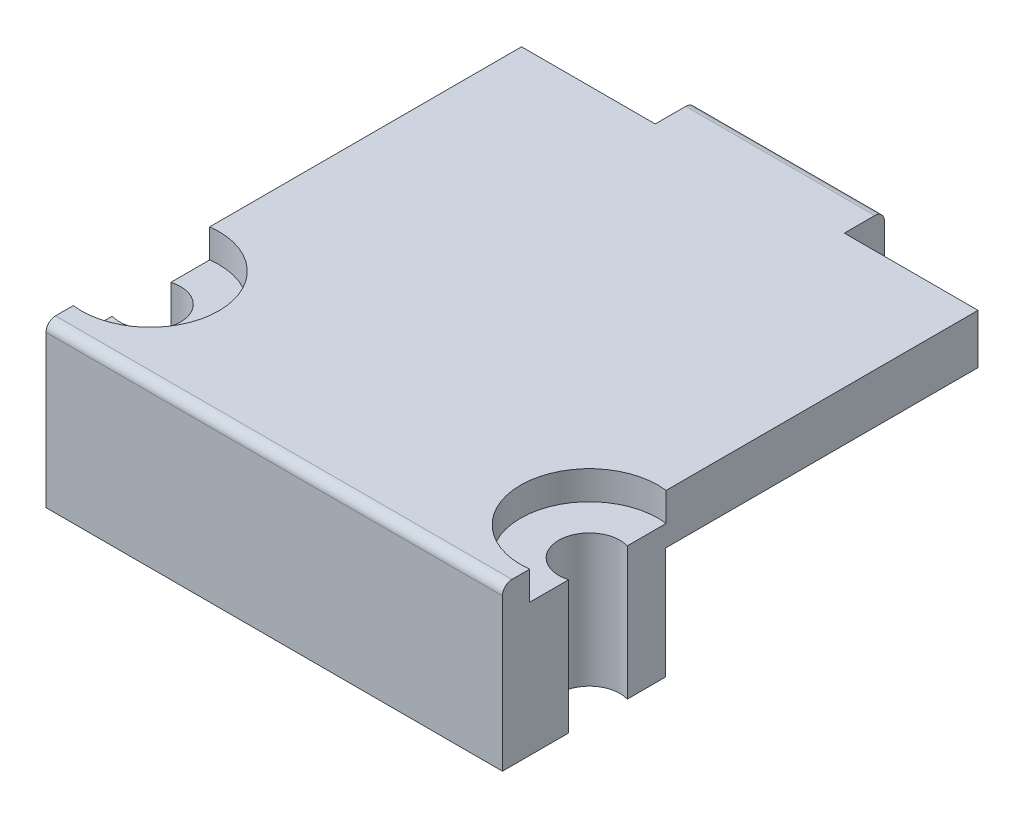
ISO-10303-21;
HEADER;
FILE_DESCRIPTION(('STEP AP214'),'2;1');
FILE_NAME('part.step','',(''),(''),'','','');
FILE_SCHEMA(('AUTOMOTIVE_DESIGN { 1 0 10303 214 1 1 1 1 }'));
ENDSEC;
DATA;
#1=APPLICATION_CONTEXT('core data for automotive mechanical design processes');
#2=APPLICATION_PROTOCOL_DEFINITION('international standard','automotive_design',2000,#1);
#3=PRODUCT_CONTEXT('',#1,'mechanical');
#4=PRODUCT('Part','Part','',(#3));
#5=PRODUCT_RELATED_PRODUCT_CATEGORY('part','',(#4));
#6=PRODUCT_DEFINITION_FORMATION('','',#4);
#7=PRODUCT_DEFINITION_CONTEXT('part definition',#1,'design');
#8=PRODUCT_DEFINITION('design','',#6,#7);
#9=PRODUCT_DEFINITION_SHAPE('','',#8);
#10=(LENGTH_UNIT() NAMED_UNIT(*) SI_UNIT(.MILLI.,.METRE.));
#11=(NAMED_UNIT(*) PLANE_ANGLE_UNIT() SI_UNIT($,.RADIAN.));
#12=(NAMED_UNIT(*) SI_UNIT($,.STERADIAN.) SOLID_ANGLE_UNIT());
#13=UNCERTAINTY_MEASURE_WITH_UNIT(LENGTH_MEASURE(1.E-05),#10,'distance_accuracy_value','');
#14=(GEOMETRIC_REPRESENTATION_CONTEXT(3) GLOBAL_UNCERTAINTY_ASSIGNED_CONTEXT((#13)) GLOBAL_UNIT_ASSIGNED_CONTEXT((#10,
#11,#12)) REPRESENTATION_CONTEXT('',''));
#15=CARTESIAN_POINT('',(0.,0.,0.));
#16=DIRECTION('',(0.,0.,1.));
#17=DIRECTION('',(1.,0.,0.));
#18=AXIS2_PLACEMENT_3D('',#15,#16,#17);
#19=CARTESIAN_POINT('',(11.5,-5.851,7.44999999999999));
#20=DIRECTION('',(0.,1.,0.));
#21=DIRECTION('',(0.,0.,1.));
#22=AXIS2_PLACEMENT_3D('',#19,#20,#21);
#23=CYLINDRICAL_SURFACE('',#22,1.6);
#24=CARTESIAN_POINT('',(11.5,1.1,7.44999999999999));
#25=DIRECTION('',(0.,1.,0.));
#26=DIRECTION('',(0.,0.,1.));
#27=AXIS2_PLACEMENT_3D('',#24,#25,#26);
#28=CIRCLE('',#27,1.6);
#29=CARTESIAN_POINT('',(11.95,1.1,8.98541525327841));
#30=VERTEX_POINT('',#29);
#31=CARTESIAN_POINT('',(11.95,1.1,5.91458474672158));
#32=VERTEX_POINT('',#31);
#33=EDGE_CURVE('E335',#30,#32,#28,.F.);
#34=ORIENTED_EDGE('',*,*,#33,.F.);
#35=DIRECTION('',(0.,1.,0.));
#36=VECTOR('',#35,1.);
#37=CARTESIAN_POINT('',(11.95,-5.851,8.98541525327841));
#38=LINE('',#37,#36);
#39=CARTESIAN_POINT('',(11.95,-5.85,8.98541525327842));
#40=VERTEX_POINT('',#39);
#41=EDGE_CURVE('E413',#30,#40,#38,.F.);
#42=ORIENTED_EDGE('',*,*,#41,.T.);
#43=CARTESIAN_POINT('',(11.5,-5.85,7.45000000000001));
#44=DIRECTION('',(0.,1.,0.));
#45=DIRECTION('',(0.,0.,1.));
#46=AXIS2_PLACEMENT_3D('',#43,#44,#45);
#47=CIRCLE('',#46,1.6);
#48=CARTESIAN_POINT('',(11.95,-5.85,5.9145847467216));
#49=VERTEX_POINT('',#48);
#50=EDGE_CURVE('E449',#40,#49,#47,.F.);
#51=ORIENTED_EDGE('',*,*,#50,.T.);
#52=DIRECTION('',(0.,1.,0.));
#53=VECTOR('',#52,1.);
#54=CARTESIAN_POINT('',(11.95,-5.851,5.91458474672158));
#55=LINE('',#54,#53);
#56=EDGE_CURVE('E409',#49,#32,#55,.T.);
#57=ORIENTED_EDGE('',*,*,#56,.T.);
#58=EDGE_LOOP('',(#34,#42,#51,#57));
#59=FACE_BOUND('',#58,.T.);
#60=ADVANCED_FACE('F45',(#59),#23,.F.);
#61=CARTESIAN_POINT('',(-11.5,-5.851,7.45));
#62=DIRECTION('',(0.,1.,0.));
#63=DIRECTION('',(0.,0.,1.));
#64=AXIS2_PLACEMENT_3D('',#61,#62,#63);
#65=CYLINDRICAL_SURFACE('',#64,1.6);
#66=CARTESIAN_POINT('',(-11.5,1.1,7.45));
#67=DIRECTION('',(0.,1.,0.));
#68=DIRECTION('',(0.,0.,1.));
#69=AXIS2_PLACEMENT_3D('',#66,#67,#68);
#70=CIRCLE('',#69,1.6);
#71=CARTESIAN_POINT('',(-11.95,1.1,5.91458474672159));
#72=VERTEX_POINT('',#71);
#73=CARTESIAN_POINT('',(-11.95,1.1,8.98541525327841));
#74=VERTEX_POINT('',#73);
#75=EDGE_CURVE('E332',#72,#74,#70,.F.);
#76=ORIENTED_EDGE('',*,*,#75,.F.);
#77=DIRECTION('',(0.,1.,0.));
#78=VECTOR('',#77,1.);
#79=CARTESIAN_POINT('',(-11.95,-5.851,5.91458474672159));
#80=LINE('',#79,#78);
#81=CARTESIAN_POINT('',(-11.95,-5.85,5.91458474672159));
#82=VERTEX_POINT('',#81);
#83=EDGE_CURVE('E403',#72,#82,#80,.F.);
#84=ORIENTED_EDGE('',*,*,#83,.T.);
#85=CARTESIAN_POINT('',(-11.5,-5.85,7.45));
#86=DIRECTION('',(0.,1.,0.));
#87=DIRECTION('',(0.,0.,1.));
#88=AXIS2_PLACEMENT_3D('',#85,#86,#87);
#89=CIRCLE('',#88,1.6);
#90=CARTESIAN_POINT('',(-11.95,-5.85,8.98541525327841));
#91=VERTEX_POINT('',#90);
#92=EDGE_CURVE('E429',#82,#91,#89,.F.);
#93=ORIENTED_EDGE('',*,*,#92,.T.);
#94=DIRECTION('',(0.,1.,0.));
#95=VECTOR('',#94,1.);
#96=CARTESIAN_POINT('',(-11.95,-5.851,8.98541525327841));
#97=LINE('',#96,#95);
#98=EDGE_CURVE('E405',#91,#74,#97,.T.);
#99=ORIENTED_EDGE('',*,*,#98,.T.);
#100=EDGE_LOOP('',(#76,#84,#93,#99));
#101=FACE_BOUND('',#100,.T.);
#102=ADVANCED_FACE('F532',(#101),#65,.F.);
#103=CARTESIAN_POINT('',(-11.95,-5.85,10.45));
#104=DIRECTION('',(0.,0.,1.));
#105=DIRECTION('',(1.,0.,0.));
#106=AXIS2_PLACEMENT_3D('',#103,#104,#105);
#107=PLANE('',#106);
#108=DIRECTION('',(0.,1.,0.));
#109=VECTOR('',#108,1.);
#110=CARTESIAN_POINT('',(-9.57602988247903,-14.0303636925574,10.45));
#111=LINE('',#110,#109);
#112=CARTESIAN_POINT('',(-9.57602988247903,0.,10.45));
#113=VERTEX_POINT('',#112);
#114=CARTESIAN_POINT('',(-9.57602988247903,-5.85,10.45));
#115=VERTEX_POINT('',#114);
#116=EDGE_CURVE('E416',#113,#115,#111,.F.);
#117=ORIENTED_EDGE('',*,*,#116,.F.);
#118=DIRECTION('',(1.,0.,0.));
#119=VECTOR('',#118,1.);
#120=CARTESIAN_POINT('',(-11.95,0.,10.45));
#121=LINE('',#120,#119);
#122=CARTESIAN_POINT('',(9.57602988247901,0.,10.45));
#123=VERTEX_POINT('',#122);
#124=EDGE_CURVE('E399',#113,#123,#121,.T.);
#125=ORIENTED_EDGE('',*,*,#124,.T.);
#126=DIRECTION('',(0.,1.,0.));
#127=VECTOR('',#126,1.);
#128=CARTESIAN_POINT('',(9.57602988247901,-14.0303636925574,10.45));
#129=LINE('',#128,#127);
#130=CARTESIAN_POINT('',(9.57602988247901,-5.85,10.45));
#131=VERTEX_POINT('',#130);
#132=EDGE_CURVE('E419',#131,#123,#129,.T.);
#133=ORIENTED_EDGE('',*,*,#132,.F.);
#134=DIRECTION('',(1.,0.,0.));
#135=VECTOR('',#134,1.);
#136=CARTESIAN_POINT('',(-11.95,-5.85,10.45));
#137=LINE('',#136,#135);
#138=EDGE_CURVE('E275',#115,#131,#137,.T.);
#139=ORIENTED_EDGE('',*,*,#138,.F.);
#140=EDGE_LOOP('',(#117,#125,#133,#139));
#141=FACE_BOUND('',#140,.T.);
#142=ADVANCED_FACE('F539',(#141),#107,.F.);
#143=CARTESIAN_POINT('',(-11.95,2.6,-12.45));
#144=DIRECTION('',(1.,0.,0.));
#145=DIRECTION('',(0.,0.,-1.));
#146=AXIS2_PLACEMENT_3D('',#143,#144,#145);
#147=PLANE('',#146);
#148=DIRECTION('',(0.,0.,1.));
#149=VECTOR('',#148,1.);
#150=CARTESIAN_POINT('',(-11.95,1.1,-12.45));
#151=LINE('',#150,#149);
#152=CARTESIAN_POINT('',(-11.95,1.1,3.8782357300628));
#153=VERTEX_POINT('',#152);
#154=EDGE_CURVE('E239',#153,#72,#151,.T.);
#155=ORIENTED_EDGE('',*,*,#154,.F.);
#156=DIRECTION('',(0.,1.,0.));
#157=VECTOR('',#156,1.);
#158=CARTESIAN_POINT('',(-11.95,1.1,3.8782357300628));
#159=LINE('',#158,#157);
#160=CARTESIAN_POINT('',(-11.95,2.6,3.8782357300628));
#161=VERTEX_POINT('',#160);
#162=EDGE_CURVE('E220',#153,#161,#159,.T.);
#163=ORIENTED_EDGE('',*,*,#162,.T.);
#164=DIRECTION('',(0.,0.,1.));
#165=VECTOR('',#164,1.);
#166=CARTESIAN_POINT('',(-11.95,2.6,-12.45));
#167=LINE('',#166,#165);
#168=CARTESIAN_POINT('',(-11.95,2.6,-12.45));
#169=VERTEX_POINT('',#168);
#170=EDGE_CURVE('E236',#169,#161,#167,.T.);
#171=ORIENTED_EDGE('',*,*,#170,.F.);
#172=DIRECTION('',(0.,-1.,0.));
#173=VECTOR('',#172,1.);
#174=CARTESIAN_POINT('',(-11.95,2.6,-12.45));
#175=LINE('',#174,#173);
#176=CARTESIAN_POINT('',(-11.95,0.,-12.45));
#177=VERTEX_POINT('',#176);
#178=EDGE_CURVE('E319',#169,#177,#175,.T.);
#179=ORIENTED_EDGE('',*,*,#178,.T.);
#180=DIRECTION('',(0.,0.,1.));
#181=VECTOR('',#180,1.);
#182=CARTESIAN_POINT('',(-11.95,0.,-12.45));
#183=LINE('',#182,#181);
#184=CARTESIAN_POINT('',(-11.95,0.,3.91458474672159));
#185=VERTEX_POINT('',#184);
#186=EDGE_CURVE('E274',#177,#185,#183,.T.);
#187=ORIENTED_EDGE('',*,*,#186,.T.);
#188=DIRECTION('',(0.,1.,0.));
#189=VECTOR('',#188,1.);
#190=CARTESIAN_POINT('',(-11.95,-14.0303636925574,3.91458474672159));
#191=LINE('',#190,#189);
#192=CARTESIAN_POINT('',(-11.95,-5.85,3.91458474672159));
#193=VERTEX_POINT('',#192);
#194=EDGE_CURVE('E436',#193,#185,#191,.T.);
#195=ORIENTED_EDGE('',*,*,#194,.F.);
#196=DIRECTION('',(0.,0.,1.));
#197=VECTOR('',#196,1.);
#198=CARTESIAN_POINT('',(-11.95,-5.85,5.91458474672159));
#199=LINE('',#198,#197);
#200=EDGE_CURVE('E432',#193,#82,#199,.T.);
#201=ORIENTED_EDGE('',*,*,#200,.T.);
#202=ORIENTED_EDGE('',*,*,#83,.F.);
#203=EDGE_LOOP('',(#155,#163,#171,#179,#187,#195,#201,#202));
#204=FACE_BOUND('',#203,.T.);
#205=ADVANCED_FACE('F234',(#204),#147,.F.);
#206=CARTESIAN_POINT('',(11.95,2.6,12.45));
#207=DIRECTION('',(-1.,0.,0.));
#208=DIRECTION('',(0.,0.,1.));
#209=AXIS2_PLACEMENT_3D('',#206,#207,#208);
#210=PLANE('',#209);
#211=DIRECTION('',(0.,0.,-1.));
#212=VECTOR('',#211,1.);
#213=CARTESIAN_POINT('',(11.95,2.6,12.45));
#214=LINE('',#213,#212);
#215=CARTESIAN_POINT('',(11.95,2.6,11.95));
#216=VERTEX_POINT('',#215);
#217=CARTESIAN_POINT('',(11.95,2.6,11.0217642699372));
#218=VERTEX_POINT('',#217);
#219=EDGE_CURVE('E254',#216,#218,#214,.T.);
#220=ORIENTED_EDGE('',*,*,#219,.F.);
#221=CARTESIAN_POINT('',(11.95,2.1,11.95));
#222=DIRECTION('',(-1.,0.,0.));
#223=DIRECTION('',(0.,0.,1.));
#224=AXIS2_PLACEMENT_3D('',#221,#222,#223);
#225=CIRCLE('',#224,0.5);
#226=CARTESIAN_POINT('',(11.95,2.1,12.45));
#227=VERTEX_POINT('',#226);
#228=EDGE_CURVE('E68',#216,#227,#225,.F.);
#229=ORIENTED_EDGE('',*,*,#228,.T.);
#230=DIRECTION('',(0.,-1.,0.));
#231=VECTOR('',#230,1.);
#232=CARTESIAN_POINT('',(11.95,2.6,12.45));
#233=LINE('',#232,#231);
#234=CARTESIAN_POINT('',(11.95,-5.85,12.45));
#235=VERTEX_POINT('',#234);
#236=EDGE_CURVE('E313',#227,#235,#233,.T.);
#237=ORIENTED_EDGE('',*,*,#236,.T.);
#238=DIRECTION('',(0.,0.,1.));
#239=VECTOR('',#238,1.);
#240=CARTESIAN_POINT('',(11.95,-5.85,10.45));
#241=LINE('',#240,#239);
#242=EDGE_CURVE('E395',#40,#235,#241,.T.);
#243=ORIENTED_EDGE('',*,*,#242,.F.);
#244=ORIENTED_EDGE('',*,*,#41,.F.);
#245=DIRECTION('',(0.,0.,-1.));
#246=VECTOR('',#245,1.);
#247=CARTESIAN_POINT('',(11.95,1.1,12.45));
#248=LINE('',#247,#246);
#249=CARTESIAN_POINT('',(11.95,1.1,11.0217642699372));
#250=VERTEX_POINT('',#249);
#251=EDGE_CURVE('E496',#250,#30,#248,.T.);
#252=ORIENTED_EDGE('',*,*,#251,.F.);
#253=DIRECTION('',(0.,1.,0.));
#254=VECTOR('',#253,1.);
#255=CARTESIAN_POINT('',(11.95,1.1,11.0217642699372));
#256=LINE('',#255,#254);
#257=EDGE_CURVE('E487',#250,#218,#256,.T.);
#258=ORIENTED_EDGE('',*,*,#257,.T.);
#259=EDGE_LOOP('',(#220,#229,#237,#243,#244,#252,#258));
#260=FACE_BOUND('',#259,.T.);
#261=ADVANCED_FACE('F557',(#260),#210,.F.);
#262=CARTESIAN_POINT('',(0.,0.,0.));
#263=DIRECTION('',(0.,1.,0.));
#264=DIRECTION('',(0.,0.,1.));
#265=AXIS2_PLACEMENT_3D('',#262,#263,#264);
#266=PLANE('',#265);
#267=CARTESIAN_POINT('',(-11.5,0.,7.45));
#268=DIRECTION('',(0.,-1.,0.));
#269=DIRECTION('',(0.,0.,1.));
#270=AXIS2_PLACEMENT_3D('',#267,#268,#269);
#271=CIRCLE('',#270,3.56393897438125);
#272=EDGE_CURVE('E439',#185,#113,#271,.T.);
#273=ORIENTED_EDGE('',*,*,#272,.F.);
#274=ORIENTED_EDGE('',*,*,#186,.F.);
#275=DIRECTION('',(-1.,0.,0.));
#276=VECTOR('',#275,1.);
#277=CARTESIAN_POINT('',(-4.95,0.,-12.45));
#278=LINE('',#277,#276);
#279=CARTESIAN_POINT('',(-4.95,0.,-12.45));
#280=VERTEX_POINT('',#279);
#281=EDGE_CURVE('E270',#280,#177,#278,.T.);
#282=ORIENTED_EDGE('',*,*,#281,.F.);
#283=DIRECTION('',(0.,0.,1.));
#284=VECTOR('',#283,1.);
#285=CARTESIAN_POINT('',(-4.95,0.,-14.55));
#286=LINE('',#285,#284);
#287=CARTESIAN_POINT('',(-4.95,0.,-14.55));
#288=VERTEX_POINT('',#287);
#289=EDGE_CURVE('E293',#288,#280,#286,.T.);
#290=ORIENTED_EDGE('',*,*,#289,.F.);
#291=DIRECTION('',(-1.,0.,0.));
#292=VECTOR('',#291,1.);
#293=CARTESIAN_POINT('',(4.95,0.,-14.55));
#294=LINE('',#293,#292);
#295=CARTESIAN_POINT('',(4.95,0.,-14.55));
#296=VERTEX_POINT('',#295);
#297=EDGE_CURVE('E289',#296,#288,#294,.T.);
#298=ORIENTED_EDGE('',*,*,#297,.F.);
#299=DIRECTION('',(0.,0.,-1.));
#300=VECTOR('',#299,1.);
#301=CARTESIAN_POINT('',(4.95,0.,-12.45));
#302=LINE('',#301,#300);
#303=CARTESIAN_POINT('',(4.95,0.,-12.45));
#304=VERTEX_POINT('',#303);
#305=EDGE_CURVE('E285',#304,#296,#302,.T.);
#306=ORIENTED_EDGE('',*,*,#305,.F.);
#307=DIRECTION('',(-1.,0.,0.));
#308=VECTOR('',#307,1.);
#309=CARTESIAN_POINT('',(11.95,0.,-12.45));
#310=LINE('',#309,#308);
#311=CARTESIAN_POINT('',(11.95,0.,-12.45));
#312=VERTEX_POINT('',#311);
#313=EDGE_CURVE('E282',#312,#304,#310,.T.);
#314=ORIENTED_EDGE('',*,*,#313,.F.);
#315=DIRECTION('',(0.,0.,-1.));
#316=VECTOR('',#315,1.);
#317=CARTESIAN_POINT('',(11.95,0.,12.45));
#318=LINE('',#317,#316);
#319=CARTESIAN_POINT('',(11.95,0.,3.9145847467216));
#320=VERTEX_POINT('',#319);
#321=EDGE_CURVE('E279',#320,#312,#318,.T.);
#322=ORIENTED_EDGE('',*,*,#321,.F.);
#323=CARTESIAN_POINT('',(11.5,0.,7.45000000000001));
#324=DIRECTION('',(0.,-1.,0.));
#325=DIRECTION('',(0.,0.,-1.));
#326=AXIS2_PLACEMENT_3D('',#323,#324,#325);
#327=CIRCLE('',#326,3.56393897438125);
#328=EDGE_CURVE('E442',#123,#320,#327,.T.);
#329=ORIENTED_EDGE('',*,*,#328,.F.);
#330=ORIENTED_EDGE('',*,*,#124,.F.);
#331=EDGE_LOOP('',(#273,#274,#282,#290,#298,#306,#314,#322,#329,#330));
#332=FACE_BOUND('',#331,.T.);
#333=ADVANCED_FACE('F381',(#332),#266,.F.);
#334=CARTESIAN_POINT('',(-4.95,2.6,-12.45));
#335=DIRECTION('',(0.,0.,1.));
#336=DIRECTION('',(1.,0.,0.));
#337=AXIS2_PLACEMENT_3D('',#334,#335,#336);
#338=PLANE('',#337);
#339=ORIENTED_EDGE('',*,*,#281,.T.);
#340=ORIENTED_EDGE('',*,*,#178,.F.);
#341=DIRECTION('',(-1.,0.,0.));
#342=VECTOR('',#341,1.);
#343=CARTESIAN_POINT('',(-4.95,2.6,-12.45));
#344=LINE('',#343,#342);
#345=CARTESIAN_POINT('',(-4.95,2.6,-12.45));
#346=VERTEX_POINT('',#345);
#347=EDGE_CURVE('E246',#346,#169,#344,.T.);
#348=ORIENTED_EDGE('',*,*,#347,.F.);
#349=DIRECTION('',(0.,-1.,0.));
#350=VECTOR('',#349,1.);
#351=CARTESIAN_POINT('',(-4.95,2.6,-12.45));
#352=LINE('',#351,#350);
#353=EDGE_CURVE('E269',#346,#280,#352,.T.);
#354=ORIENTED_EDGE('',*,*,#353,.T.);
#355=EDGE_LOOP('',(#339,#340,#348,#354));
#356=FACE_BOUND('',#355,.T.);
#357=ADVANCED_FACE('F383',(#356),#338,.F.);
#358=DIRECTION('',(0.,-1.,0.));
#359=VECTOR('',#358,1.);
#360=CARTESIAN_POINT('',(-11.95,2.6,12.45));
#361=LINE('',#360,#359);
#362=CARTESIAN_POINT('',(-11.95,2.1,12.45));
#363=VERTEX_POINT('',#362);
#364=CARTESIAN_POINT('',(-11.95,-5.85,12.45));
#365=VERTEX_POINT('',#364);
#366=EDGE_CURVE('E316',#363,#365,#361,.T.);
#367=ORIENTED_EDGE('',*,*,#366,.F.);
#368=CARTESIAN_POINT('',(-11.95,2.1,11.95));
#369=DIRECTION('',(1.,0.,0.));
#370=DIRECTION('',(0.,0.,-1.));
#371=AXIS2_PLACEMENT_3D('',#368,#369,#370);
#372=CIRCLE('',#371,0.5);
#373=CARTESIAN_POINT('',(-11.95,2.6,11.95));
#374=VERTEX_POINT('',#373);
#375=EDGE_CURVE('E11',#363,#374,#372,.F.);
#376=ORIENTED_EDGE('',*,*,#375,.T.);
#377=CARTESIAN_POINT('',(-11.95,2.6,11.0217642699372));
#378=VERTEX_POINT('',#377);
#379=EDGE_CURVE('E250',#378,#374,#167,.T.);
#380=ORIENTED_EDGE('',*,*,#379,.F.);
#381=DIRECTION('',(0.,1.,0.));
#382=VECTOR('',#381,1.);
#383=CARTESIAN_POINT('',(-11.95,1.1,11.0217642699372));
#384=LINE('',#383,#382);
#385=CARTESIAN_POINT('',(-11.95,1.1,11.0217642699372));
#386=VERTEX_POINT('',#385);
#387=EDGE_CURVE('E223',#378,#386,#384,.F.);
#388=ORIENTED_EDGE('',*,*,#387,.T.);
#389=DIRECTION('',(0.,0.,1.));
#390=VECTOR('',#389,1.);
#391=CARTESIAN_POINT('',(-11.95,1.1,-12.45));
#392=LINE('',#391,#390);
#393=EDGE_CURVE('E504',#74,#386,#392,.T.);
#394=ORIENTED_EDGE('',*,*,#393,.F.);
#395=ORIENTED_EDGE('',*,*,#98,.F.);
#396=DIRECTION('',(0.,0.,-1.));
#397=VECTOR('',#396,1.);
#398=CARTESIAN_POINT('',(-11.95,-5.85,10.45));
#399=LINE('',#398,#397);
#400=EDGE_CURVE('E388',#365,#91,#399,.T.);
#401=ORIENTED_EDGE('',*,*,#400,.F.);
#402=EDGE_LOOP('',(#367,#376,#380,#388,#394,#395,#401));
#403=FACE_BOUND('',#402,.T.);
#404=ADVANCED_FACE('F521',(#403),#147,.F.);
#405=CARTESIAN_POINT('',(-11.95,2.6,12.45));
#406=DIRECTION('',(0.,0.,-1.));
#407=DIRECTION('',(-1.,0.,0.));
#408=AXIS2_PLACEMENT_3D('',#405,#406,#407);
#409=PLANE('',#408);
#410=ORIENTED_EDGE('',*,*,#236,.F.);
#411=DIRECTION('',(1.,0.,0.));
#412=VECTOR('',#411,1.);
#413=CARTESIAN_POINT('',(-11.95,2.1,12.45));
#414=LINE('',#413,#412);
#415=EDGE_CURVE('E54',#227,#363,#414,.F.);
#416=ORIENTED_EDGE('',*,*,#415,.T.);
#417=ORIENTED_EDGE('',*,*,#366,.T.);
#418=DIRECTION('',(-1.,0.,0.));
#419=VECTOR('',#418,1.);
#420=CARTESIAN_POINT('',(-11.95,-5.85,12.45));
#421=LINE('',#420,#419);
#422=EDGE_CURVE('E391',#235,#365,#421,.T.);
#423=ORIENTED_EDGE('',*,*,#422,.F.);
#424=EDGE_LOOP('',(#410,#416,#417,#423));
#425=FACE_BOUND('',#424,.T.);
#426=ADVANCED_FACE('F571',(#425),#409,.F.);
#427=CARTESIAN_POINT('',(11.95,2.6,3.8782357300628));
#428=VERTEX_POINT('',#427);
#429=CARTESIAN_POINT('',(11.95,2.6,-12.45));
#430=VERTEX_POINT('',#429);
#431=EDGE_CURVE('E249',#428,#430,#214,.T.);
#432=ORIENTED_EDGE('',*,*,#431,.F.);
#433=DIRECTION('',(0.,1.,0.));
#434=VECTOR('',#433,1.);
#435=CARTESIAN_POINT('',(11.95,1.1,3.8782357300628));
#436=LINE('',#435,#434);
#437=CARTESIAN_POINT('',(11.95,1.1,3.8782357300628));
#438=VERTEX_POINT('',#437);
#439=EDGE_CURVE('E241',#428,#438,#436,.F.);
#440=ORIENTED_EDGE('',*,*,#439,.T.);
#441=DIRECTION('',(0.,0.,-1.));
#442=VECTOR('',#441,1.);
#443=CARTESIAN_POINT('',(11.95,1.1,12.45));
#444=LINE('',#443,#442);
#445=EDGE_CURVE('E499',#32,#438,#444,.T.);
#446=ORIENTED_EDGE('',*,*,#445,.F.);
#447=ORIENTED_EDGE('',*,*,#56,.F.);
#448=DIRECTION('',(0.,0.,-1.));
#449=VECTOR('',#448,1.);
#450=CARTESIAN_POINT('',(11.95,-5.85,5.9145847467216));
#451=LINE('',#450,#449);
#452=CARTESIAN_POINT('',(11.95,-5.85,3.9145847467216));
#453=VERTEX_POINT('',#452);
#454=EDGE_CURVE('E453',#49,#453,#451,.T.);
#455=ORIENTED_EDGE('',*,*,#454,.T.);
#456=DIRECTION('',(0.,1.,0.));
#457=VECTOR('',#456,1.);
#458=CARTESIAN_POINT('',(11.95,-14.0303636925574,3.9145847467216));
#459=LINE('',#458,#457);
#460=EDGE_CURVE('E445',#453,#320,#459,.T.);
#461=ORIENTED_EDGE('',*,*,#460,.T.);
#462=ORIENTED_EDGE('',*,*,#321,.T.);
#463=DIRECTION('',(0.,-1.,0.));
#464=VECTOR('',#463,1.);
#465=CARTESIAN_POINT('',(11.95,2.6,-12.45));
#466=LINE('',#465,#464);
#467=EDGE_CURVE('E309',#430,#312,#466,.T.);
#468=ORIENTED_EDGE('',*,*,#467,.F.);
#469=EDGE_LOOP('',(#432,#440,#446,#447,#455,#461,#462,#468));
#470=FACE_BOUND('',#469,.T.);
#471=ADVANCED_FACE('F567',(#470),#210,.F.);
#472=CARTESIAN_POINT('',(11.95,2.6,-12.45));
#473=DIRECTION('',(0.,0.,1.));
#474=DIRECTION('',(1.,0.,0.));
#475=AXIS2_PLACEMENT_3D('',#472,#473,#474);
#476=PLANE('',#475);
#477=ORIENTED_EDGE('',*,*,#313,.T.);
#478=DIRECTION('',(0.,-1.,0.));
#479=VECTOR('',#478,1.);
#480=CARTESIAN_POINT('',(4.95,2.6,-12.45));
#481=LINE('',#480,#479);
#482=CARTESIAN_POINT('',(4.95,2.6,-12.45));
#483=VERTEX_POINT('',#482);
#484=EDGE_CURVE('E305',#483,#304,#481,.T.);
#485=ORIENTED_EDGE('',*,*,#484,.F.);
#486=DIRECTION('',(-1.,0.,0.));
#487=VECTOR('',#486,1.);
#488=CARTESIAN_POINT('',(11.95,2.6,-12.45));
#489=LINE('',#488,#487);
#490=EDGE_CURVE('E260',#430,#483,#489,.T.);
#491=ORIENTED_EDGE('',*,*,#490,.F.);
#492=ORIENTED_EDGE('',*,*,#467,.T.);
#493=EDGE_LOOP('',(#477,#485,#491,#492));
#494=FACE_BOUND('',#493,.T.);
#495=ADVANCED_FACE('F564',(#494),#476,.F.);
#496=CARTESIAN_POINT('',(4.95,2.6,-12.45));
#497=DIRECTION('',(-1.,0.,0.));
#498=DIRECTION('',(0.,0.,1.));
#499=AXIS2_PLACEMENT_3D('',#496,#497,#498);
#500=PLANE('',#499);
#501=DIRECTION('',(0.,-1.,0.));
#502=VECTOR('',#501,1.);
#503=CARTESIAN_POINT('',(4.95,2.6,-14.55));
#504=LINE('',#503,#502);
#505=CARTESIAN_POINT('',(4.95,2.1,-14.55));
#506=VERTEX_POINT('',#505);
#507=EDGE_CURVE('E302',#506,#296,#504,.T.);
#508=ORIENTED_EDGE('',*,*,#507,.F.);
#509=CARTESIAN_POINT('',(4.95,2.1,-14.05));
#510=DIRECTION('',(-1.,0.,0.));
#511=DIRECTION('',(0.,0.,1.));
#512=AXIS2_PLACEMENT_3D('',#509,#510,#511);
#513=CIRCLE('',#512,0.5);
#514=CARTESIAN_POINT('',(4.95,2.6,-14.05));
#515=VERTEX_POINT('',#514);
#516=EDGE_CURVE('E352',#506,#515,#513,.F.);
#517=ORIENTED_EDGE('',*,*,#516,.T.);
#518=DIRECTION('',(0.,0.,-1.));
#519=VECTOR('',#518,1.);
#520=CARTESIAN_POINT('',(4.95,2.6,-12.45));
#521=LINE('',#520,#519);
#522=EDGE_CURVE('E263',#483,#515,#521,.T.);
#523=ORIENTED_EDGE('',*,*,#522,.F.);
#524=ORIENTED_EDGE('',*,*,#484,.T.);
#525=ORIENTED_EDGE('',*,*,#305,.T.);
#526=EDGE_LOOP('',(#508,#517,#523,#524,#525));
#527=FACE_BOUND('',#526,.T.);
#528=ADVANCED_FACE('F361',(#527),#500,.F.);
#529=CARTESIAN_POINT('',(4.95,2.6,-14.55));
#530=DIRECTION('',(0.,0.,1.));
#531=DIRECTION('',(1.,0.,0.));
#532=AXIS2_PLACEMENT_3D('',#529,#530,#531);
#533=PLANE('',#532);
#534=DIRECTION('',(0.,-1.,0.));
#535=VECTOR('',#534,1.);
#536=CARTESIAN_POINT('',(-4.95,2.6,-14.55));
#537=LINE('',#536,#535);
#538=CARTESIAN_POINT('',(-4.95,2.1,-14.55));
#539=VERTEX_POINT('',#538);
#540=EDGE_CURVE('E299',#539,#288,#537,.T.);
#541=ORIENTED_EDGE('',*,*,#540,.F.);
#542=DIRECTION('',(-1.,0.,0.));
#543=VECTOR('',#542,1.);
#544=CARTESIAN_POINT('',(4.95,2.1,-14.55));
#545=LINE('',#544,#543);
#546=EDGE_CURVE('E349',#539,#506,#545,.F.);
#547=ORIENTED_EDGE('',*,*,#546,.T.);
#548=ORIENTED_EDGE('',*,*,#507,.T.);
#549=ORIENTED_EDGE('',*,*,#297,.T.);
#550=EDGE_LOOP('',(#541,#547,#548,#549));
#551=FACE_BOUND('',#550,.T.);
#552=ADVANCED_FACE('F374',(#551),#533,.F.);
#553=CARTESIAN_POINT('',(-4.95,2.6,-14.55));
#554=DIRECTION('',(1.,0.,0.));
#555=DIRECTION('',(0.,0.,-1.));
#556=AXIS2_PLACEMENT_3D('',#553,#554,#555);
#557=PLANE('',#556);
#558=DIRECTION('',(0.,0.,1.));
#559=VECTOR('',#558,1.);
#560=CARTESIAN_POINT('',(-4.95,2.6,-14.55));
#561=LINE('',#560,#559);
#562=CARTESIAN_POINT('',(-4.95,2.6,-14.05));
#563=VERTEX_POINT('',#562);
#564=EDGE_CURVE('E266',#563,#346,#561,.T.);
#565=ORIENTED_EDGE('',*,*,#564,.F.);
#566=CARTESIAN_POINT('',(-4.95,2.1,-14.05));
#567=DIRECTION('',(1.,0.,0.));
#568=DIRECTION('',(0.,0.,-1.));
#569=AXIS2_PLACEMENT_3D('',#566,#567,#568);
#570=CIRCLE('',#569,0.5);
#571=EDGE_CURVE('E346',#563,#539,#570,.F.);
#572=ORIENTED_EDGE('',*,*,#571,.T.);
#573=ORIENTED_EDGE('',*,*,#540,.T.);
#574=ORIENTED_EDGE('',*,*,#289,.T.);
#575=ORIENTED_EDGE('',*,*,#353,.F.);
#576=EDGE_LOOP('',(#565,#572,#573,#574,#575));
#577=FACE_BOUND('',#576,.T.);
#578=ADVANCED_FACE('F371',(#577),#557,.F.);
#579=CARTESIAN_POINT('',(0.,2.6,0.));
#580=DIRECTION('',(0.,1.,0.));
#581=DIRECTION('',(0.,0.,1.));
#582=AXIS2_PLACEMENT_3D('',#579,#580,#581);
#583=PLANE('',#582);
#584=ORIENTED_EDGE('',*,*,#522,.T.);
#585=DIRECTION('',(-1.,0.,0.));
#586=VECTOR('',#585,1.);
#587=CARTESIAN_POINT('',(-4.95,2.6,-14.05));
#588=LINE('',#587,#586);
#589=EDGE_CURVE('E342',#515,#563,#588,.T.);
#590=ORIENTED_EDGE('',*,*,#589,.T.);
#591=ORIENTED_EDGE('',*,*,#564,.T.);
#592=ORIENTED_EDGE('',*,*,#347,.T.);
#593=ORIENTED_EDGE('',*,*,#170,.T.);
#594=CARTESIAN_POINT('',(-11.5,2.6,7.45));
#595=DIRECTION('',(0.,1.,0.));
#596=DIRECTION('',(0.,0.,1.));
#597=AXIS2_PLACEMENT_3D('',#594,#595,#596);
#598=CIRCLE('',#597,3.6);
#599=EDGE_CURVE('E216',#378,#161,#598,.T.);
#600=ORIENTED_EDGE('',*,*,#599,.F.);
#601=ORIENTED_EDGE('',*,*,#379,.T.);
#602=DIRECTION('',(1.,0.,0.));
#603=VECTOR('',#602,1.);
#604=CARTESIAN_POINT('',(11.95,2.6,11.95));
#605=LINE('',#604,#603);
#606=EDGE_CURVE('E338',#374,#216,#605,.T.);
#607=ORIENTED_EDGE('',*,*,#606,.T.);
#608=ORIENTED_EDGE('',*,*,#219,.T.);
#609=CARTESIAN_POINT('',(11.5,2.6,7.44999999999999));
#610=DIRECTION('',(0.,1.,0.));
#611=DIRECTION('',(0.,0.,1.));
#612=AXIS2_PLACEMENT_3D('',#609,#610,#611);
#613=CIRCLE('',#612,3.6);
#614=EDGE_CURVE('E229',#428,#218,#613,.T.);
#615=ORIENTED_EDGE('',*,*,#614,.F.);
#616=ORIENTED_EDGE('',*,*,#431,.T.);
#617=ORIENTED_EDGE('',*,*,#490,.T.);
#618=EDGE_LOOP('',(#584,#590,#591,#592,#593,#600,#601,#607,#608,#615,#616,#617));
#619=FACE_BOUND('',#618,.T.);
#620=ADVANCED_FACE('F244',(#619),#583,.T.);
#621=CARTESIAN_POINT('',(0.,-5.85,0.));
#622=DIRECTION('',(0.,1.,0.));
#623=DIRECTION('',(0.,0.,1.));
#624=AXIS2_PLACEMENT_3D('',#621,#622,#623);
#625=PLANE('',#624);
#626=CARTESIAN_POINT('',(-11.5,-5.85,7.45));
#627=DIRECTION('',(0.,1.,0.));
#628=DIRECTION('',(0.,0.,1.));
#629=AXIS2_PLACEMENT_3D('',#626,#627,#628);
#630=CIRCLE('',#629,3.56393897438125);
#631=CARTESIAN_POINT('',(-8.1100647479467,-5.85,6.35));
#632=VERTEX_POINT('',#631);
#633=EDGE_CURVE('E426',#632,#193,#630,.T.);
#634=ORIENTED_EDGE('',*,*,#633,.F.);
#635=DIRECTION('',(1.,0.,0.));
#636=VECTOR('',#635,1.);
#637=CARTESIAN_POINT('',(-8.43606102561875,-5.85,6.35));
#638=LINE('',#637,#636);
#639=CARTESIAN_POINT('',(-8.43606102561875,-5.85,6.35));
#640=VERTEX_POINT('',#639);
#641=EDGE_CURVE('E484',#640,#632,#638,.T.);
#642=ORIENTED_EDGE('',*,*,#641,.F.);
#643=DIRECTION('',(0.,0.,1.));
#644=VECTOR('',#643,1.);
#645=CARTESIAN_POINT('',(-8.43606102561875,-5.85,6.35));
#646=LINE('',#645,#644);
#647=CARTESIAN_POINT('',(-8.43606102561875,-5.85,8.55));
#648=VERTEX_POINT('',#647);
#649=EDGE_CURVE('E476',#640,#648,#646,.T.);
#650=ORIENTED_EDGE('',*,*,#649,.T.);
#651=DIRECTION('',(1.,0.,0.));
#652=VECTOR('',#651,1.);
#653=CARTESIAN_POINT('',(-8.43606102561875,-5.85,8.55));
#654=LINE('',#653,#652);
#655=CARTESIAN_POINT('',(-8.1100647479467,-5.85,8.55));
#656=VERTEX_POINT('',#655);
#657=EDGE_CURVE('E480',#648,#656,#654,.T.);
#658=ORIENTED_EDGE('',*,*,#657,.T.);
#659=EDGE_CURVE('E422',#115,#656,#630,.T.);
#660=ORIENTED_EDGE('',*,*,#659,.F.);
#661=ORIENTED_EDGE('',*,*,#138,.T.);
#662=CARTESIAN_POINT('',(11.5,-5.85,7.45000000000001));
#663=DIRECTION('',(0.,1.,0.));
#664=DIRECTION('',(0.,0.,1.));
#665=AXIS2_PLACEMENT_3D('',#662,#663,#664);
#666=CIRCLE('',#665,3.56393897438125);
#667=EDGE_CURVE('E457',#453,#131,#666,.T.);
#668=ORIENTED_EDGE('',*,*,#667,.F.);
#669=ORIENTED_EDGE('',*,*,#454,.F.);
#670=ORIENTED_EDGE('',*,*,#50,.F.);
#671=ORIENTED_EDGE('',*,*,#242,.T.);
#672=ORIENTED_EDGE('',*,*,#422,.T.);
#673=ORIENTED_EDGE('',*,*,#400,.T.);
#674=ORIENTED_EDGE('',*,*,#92,.F.);
#675=ORIENTED_EDGE('',*,*,#200,.F.);
#676=EDGE_LOOP('',(#634,#642,#650,#658,#660,#661,#668,#669,#670,#671,#672,#673,#674,#675));
#677=FACE_BOUND('',#676,.T.);
#678=ADVANCED_FACE('F545',(#677),#625,.F.);
#679=CARTESIAN_POINT('',(-11.5,-14.0303636925574,7.45));
#680=DIRECTION('',(0.,1.,0.));
#681=DIRECTION('',(0.,0.,1.));
#682=AXIS2_PLACEMENT_3D('',#679,#680,#681);
#683=CYLINDRICAL_SURFACE('',#682,3.56393897438125);
#684=CARTESIAN_POINT('',(-11.5,-3.75,7.45));
#685=DIRECTION('',(0.,-1.,0.));
#686=DIRECTION('',(0.,0.,-1.));
#687=AXIS2_PLACEMENT_3D('',#684,#685,#686);
#688=CIRCLE('',#687,3.56393897438125);
#689=CARTESIAN_POINT('',(-8.1100647479467,-3.75,6.35));
#690=VERTEX_POINT('',#689);
#691=CARTESIAN_POINT('',(-8.1100647479467,-3.75,8.55));
#692=VERTEX_POINT('',#691);
#693=EDGE_CURVE('E322',#690,#692,#688,.T.);
#694=ORIENTED_EDGE('',*,*,#693,.F.);
#695=DIRECTION('',(0.,1.,0.));
#696=VECTOR('',#695,1.);
#697=CARTESIAN_POINT('',(-8.1100647479467,-14.0303636925574,6.35));
#698=LINE('',#697,#696);
#699=EDGE_CURVE('E328',#690,#632,#698,.F.);
#700=ORIENTED_EDGE('',*,*,#699,.T.);
#701=ORIENTED_EDGE('',*,*,#633,.T.);
#702=ORIENTED_EDGE('',*,*,#194,.T.);
#703=ORIENTED_EDGE('',*,*,#272,.T.);
#704=ORIENTED_EDGE('',*,*,#116,.T.);
#705=ORIENTED_EDGE('',*,*,#659,.T.);
#706=DIRECTION('',(0.,1.,0.));
#707=VECTOR('',#706,1.);
#708=CARTESIAN_POINT('',(-8.1100647479467,-14.0303636925574,8.55));
#709=LINE('',#708,#707);
#710=EDGE_CURVE('E325',#692,#656,#709,.F.);
#711=ORIENTED_EDGE('',*,*,#710,.F.);
#712=EDGE_LOOP('',(#694,#700,#701,#702,#703,#704,#705,#711));
#713=FACE_BOUND('',#712,.T.);
#714=ADVANCED_FACE('F548',(#713),#683,.T.);
#715=CARTESIAN_POINT('',(11.5,-14.0303636925574,7.45000000000001));
#716=DIRECTION('',(0.,1.,0.));
#717=DIRECTION('',(0.,0.,1.));
#718=AXIS2_PLACEMENT_3D('',#715,#716,#717);
#719=CYLINDRICAL_SURFACE('',#718,3.56393897438125);
#720=ORIENTED_EDGE('',*,*,#667,.T.);
#721=ORIENTED_EDGE('',*,*,#132,.T.);
#722=ORIENTED_EDGE('',*,*,#328,.T.);
#723=ORIENTED_EDGE('',*,*,#460,.F.);
#724=EDGE_LOOP('',(#720,#721,#722,#723));
#725=FACE_BOUND('',#724,.T.);
#726=ADVANCED_FACE('F605',(#725),#719,.T.);
#727=CARTESIAN_POINT('',(-8.43606102561875,-3.75,6.35));
#728=DIRECTION('',(0.,0.,-1.));
#729=DIRECTION('',(-1.,0.,0.));
#730=AXIS2_PLACEMENT_3D('',#727,#728,#729);
#731=PLANE('',#730);
#732=DIRECTION('',(1.,0.,0.));
#733=VECTOR('',#732,1.);
#734=CARTESIAN_POINT('',(-8.43606102561875,-3.75,6.35));
#735=LINE('',#734,#733);
#736=CARTESIAN_POINT('',(-8.43606102561875,-3.75,6.35));
#737=VERTEX_POINT('',#736);
#738=EDGE_CURVE('E473',#737,#690,#735,.T.);
#739=ORIENTED_EDGE('',*,*,#738,.F.);
#740=DIRECTION('',(0.,-1.,0.));
#741=VECTOR('',#740,1.);
#742=CARTESIAN_POINT('',(-8.43606102561875,-3.75,6.35));
#743=LINE('',#742,#741);
#744=EDGE_CURVE('E460',#737,#640,#743,.T.);
#745=ORIENTED_EDGE('',*,*,#744,.T.);
#746=ORIENTED_EDGE('',*,*,#641,.T.);
#747=ORIENTED_EDGE('',*,*,#699,.F.);
#748=EDGE_LOOP('',(#739,#745,#746,#747));
#749=FACE_BOUND('',#748,.T.);
#750=ADVANCED_FACE('F608',(#749),#731,.F.);
#751=CARTESIAN_POINT('',(-8.43606102561875,-3.75,8.55));
#752=DIRECTION('',(0.,0.,-1.));
#753=DIRECTION('',(-1.,0.,0.));
#754=AXIS2_PLACEMENT_3D('',#751,#752,#753);
#755=PLANE('',#754);
#756=ORIENTED_EDGE('',*,*,#710,.T.);
#757=ORIENTED_EDGE('',*,*,#657,.F.);
#758=DIRECTION('',(0.,-1.,0.));
#759=VECTOR('',#758,1.);
#760=CARTESIAN_POINT('',(-8.43606102561875,-3.75,8.55));
#761=LINE('',#760,#759);
#762=CARTESIAN_POINT('',(-8.43606102561875,-3.75,8.55));
#763=VERTEX_POINT('',#762);
#764=EDGE_CURVE('E463',#763,#648,#761,.T.);
#765=ORIENTED_EDGE('',*,*,#764,.F.);
#766=DIRECTION('',(1.,0.,0.));
#767=VECTOR('',#766,1.);
#768=CARTESIAN_POINT('',(-8.43606102561875,-3.75,8.55));
#769=LINE('',#768,#767);
#770=EDGE_CURVE('E469',#763,#692,#769,.T.);
#771=ORIENTED_EDGE('',*,*,#770,.T.);
#772=EDGE_LOOP('',(#756,#757,#765,#771));
#773=FACE_BOUND('',#772,.T.);
#774=ADVANCED_FACE('F630',(#773),#755,.T.);
#775=CARTESIAN_POINT('',(0.,-3.75,0.));
#776=DIRECTION('',(0.,-1.,0.));
#777=DIRECTION('',(0.,0.,-1.));
#778=AXIS2_PLACEMENT_3D('',#775,#776,#777);
#779=PLANE('',#778);
#780=ORIENTED_EDGE('',*,*,#693,.T.);
#781=ORIENTED_EDGE('',*,*,#770,.F.);
#782=DIRECTION('',(0.,0.,1.));
#783=VECTOR('',#782,1.);
#784=CARTESIAN_POINT('',(-8.43606102561875,-3.75,6.35));
#785=LINE('',#784,#783);
#786=EDGE_CURVE('E466',#737,#763,#785,.T.);
#787=ORIENTED_EDGE('',*,*,#786,.F.);
#788=ORIENTED_EDGE('',*,*,#738,.T.);
#789=EDGE_LOOP('',(#780,#781,#787,#788));
#790=FACE_BOUND('',#789,.T.);
#791=ADVANCED_FACE('F639',(#790),#779,.T.);
#792=CARTESIAN_POINT('',(-8.43606102561875,-3.75,6.35));
#793=DIRECTION('',(1.,0.,0.));
#794=DIRECTION('',(0.,0.,-1.));
#795=AXIS2_PLACEMENT_3D('',#792,#793,#794);
#796=PLANE('',#795);
#797=ORIENTED_EDGE('',*,*,#649,.F.);
#798=ORIENTED_EDGE('',*,*,#744,.F.);
#799=ORIENTED_EDGE('',*,*,#786,.T.);
#800=ORIENTED_EDGE('',*,*,#764,.T.);
#801=EDGE_LOOP('',(#797,#798,#799,#800));
#802=FACE_BOUND('',#801,.T.);
#803=ADVANCED_FACE('F647',(#802),#796,.T.);
#804=CARTESIAN_POINT('',(-11.5,1.1,7.45));
#805=DIRECTION('',(0.,1.,0.));
#806=DIRECTION('',(0.,0.,1.));
#807=AXIS2_PLACEMENT_3D('',#804,#805,#806);
#808=CYLINDRICAL_SURFACE('',#807,3.6);
#809=CARTESIAN_POINT('',(-11.5,1.1,7.45));
#810=DIRECTION('',(0.,1.,0.));
#811=DIRECTION('',(0.,0.,1.));
#812=AXIS2_PLACEMENT_3D('',#809,#810,#811);
#813=CIRCLE('',#812,3.6);
#814=EDGE_CURVE('E230',#386,#153,#813,.T.);
#815=ORIENTED_EDGE('',*,*,#814,.F.);
#816=ORIENTED_EDGE('',*,*,#387,.F.);
#817=ORIENTED_EDGE('',*,*,#599,.T.);
#818=ORIENTED_EDGE('',*,*,#162,.F.);
#819=EDGE_LOOP('',(#815,#816,#817,#818));
#820=FACE_BOUND('',#819,.T.);
#821=ADVANCED_FACE('F219',(#820),#808,.F.);
#822=CARTESIAN_POINT('',(-11.5,1.1,7.45));
#823=DIRECTION('',(0.,1.,0.));
#824=DIRECTION('',(0.,0.,1.));
#825=AXIS2_PLACEMENT_3D('',#822,#823,#824);
#826=PLANE('',#825);
#827=ORIENTED_EDGE('',*,*,#154,.T.);
#828=ORIENTED_EDGE('',*,*,#75,.T.);
#829=ORIENTED_EDGE('',*,*,#393,.T.);
#830=ORIENTED_EDGE('',*,*,#814,.T.);
#831=EDGE_LOOP('',(#827,#828,#829,#830));
#832=FACE_BOUND('',#831,.T.);
#833=ADVANCED_FACE('F517',(#832),#826,.T.);
#834=CARTESIAN_POINT('',(11.5,1.1,7.44999999999999));
#835=DIRECTION('',(0.,1.,0.));
#836=DIRECTION('',(0.,0.,1.));
#837=AXIS2_PLACEMENT_3D('',#834,#835,#836);
#838=CYLINDRICAL_SURFACE('',#837,3.6);
#839=CARTESIAN_POINT('',(11.5,1.1,7.44999999999999));
#840=DIRECTION('',(0.,1.,0.));
#841=DIRECTION('',(0.,0.,1.));
#842=AXIS2_PLACEMENT_3D('',#839,#840,#841);
#843=CIRCLE('',#842,3.6);
#844=EDGE_CURVE('E507',#438,#250,#843,.T.);
#845=ORIENTED_EDGE('',*,*,#844,.F.);
#846=ORIENTED_EDGE('',*,*,#439,.F.);
#847=ORIENTED_EDGE('',*,*,#614,.T.);
#848=ORIENTED_EDGE('',*,*,#257,.F.);
#849=EDGE_LOOP('',(#845,#846,#847,#848));
#850=FACE_BOUND('',#849,.T.);
#851=ADVANCED_FACE('F690',(#850),#838,.F.);
#852=CARTESIAN_POINT('',(11.5,1.1,7.44999999999999));
#853=DIRECTION('',(0.,1.,0.));
#854=DIRECTION('',(0.,0.,1.));
#855=AXIS2_PLACEMENT_3D('',#852,#853,#854);
#856=PLANE('',#855);
#857=ORIENTED_EDGE('',*,*,#251,.T.);
#858=ORIENTED_EDGE('',*,*,#33,.T.);
#859=ORIENTED_EDGE('',*,*,#445,.T.);
#860=ORIENTED_EDGE('',*,*,#844,.T.);
#861=EDGE_LOOP('',(#857,#858,#859,#860));
#862=FACE_BOUND('',#861,.T.);
#863=ADVANCED_FACE('F530',(#862),#856,.T.);
#864=CARTESIAN_POINT('',(0.,2.1,-14.05));
#865=DIRECTION('',(1.,0.,0.));
#866=DIRECTION('',(0.,0.,-1.));
#867=AXIS2_PLACEMENT_3D('',#864,#865,#866);
#868=CYLINDRICAL_SURFACE('',#867,0.5);
#869=ORIENTED_EDGE('',*,*,#516,.F.);
#870=ORIENTED_EDGE('',*,*,#546,.F.);
#871=ORIENTED_EDGE('',*,*,#571,.F.);
#872=ORIENTED_EDGE('',*,*,#589,.F.);
#873=EDGE_LOOP('',(#869,#870,#871,#872));
#874=FACE_BOUND('',#873,.T.);
#875=ADVANCED_FACE('F368',(#874),#868,.T.);
#876=CARTESIAN_POINT('',(0.,2.1,11.95));
#877=DIRECTION('',(-1.,0.,0.));
#878=DIRECTION('',(0.,0.,1.));
#879=AXIS2_PLACEMENT_3D('',#876,#877,#878);
#880=CYLINDRICAL_SURFACE('',#879,0.5);
#881=ORIENTED_EDGE('',*,*,#375,.F.);
#882=ORIENTED_EDGE('',*,*,#415,.F.);
#883=ORIENTED_EDGE('',*,*,#228,.F.);
#884=ORIENTED_EDGE('',*,*,#606,.F.);
#885=EDGE_LOOP('',(#881,#882,#883,#884));
#886=FACE_BOUND('',#885,.T.);
#887=ADVANCED_FACE('F47',(#886),#880,.T.);
#888=CLOSED_SHELL('',(#60,#102,#142,#205,#261,#333,#357,#404,#426,#471,#495,#528,#552,#578,#620,
#678,#714,#726,#750,#774,#791,#803,#821,#833,#851,#863,#875,#887));
#889=MANIFOLD_SOLID_BREP('B2',#888);
#890=ADVANCED_BREP_SHAPE_REPRESENTATION('',(#18,#889),#14);
#891=SHAPE_DEFINITION_REPRESENTATION(#9,#890);
ENDSEC;
END-ISO-10303-21;
